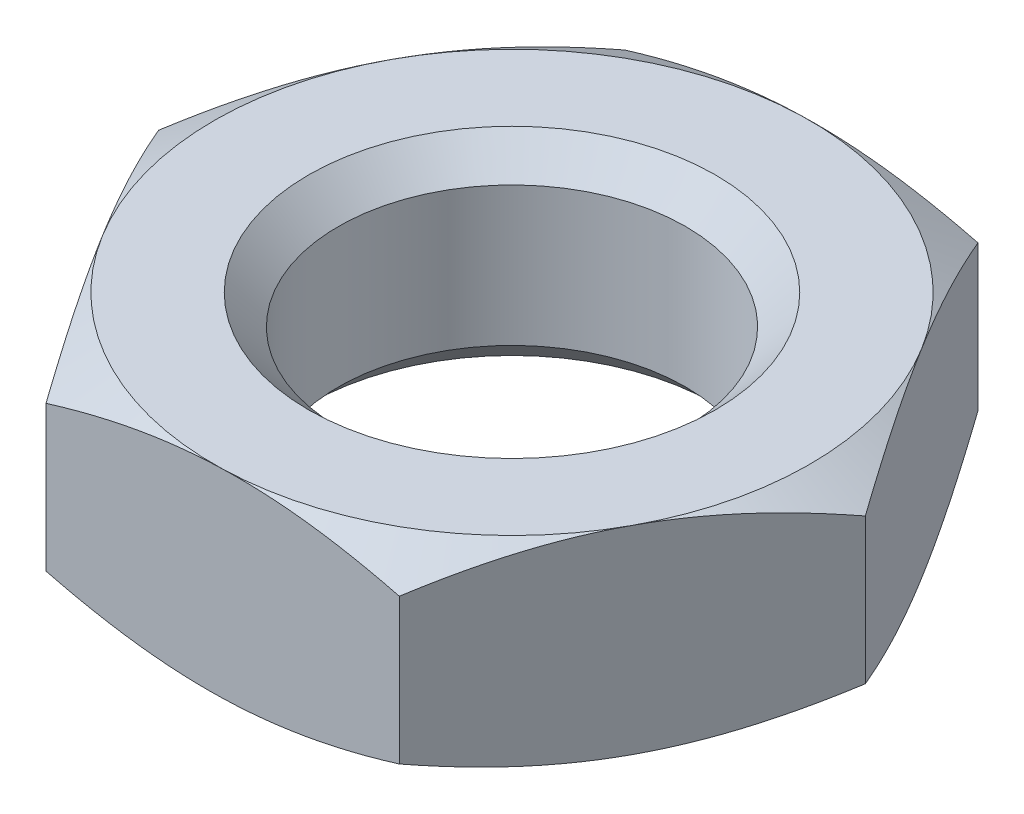
ISO-10303-21;
HEADER;
FILE_DESCRIPTION(('STEP AP214'),'2;1');
FILE_NAME('part.step','',(''),(''),'','','');
FILE_SCHEMA(('AUTOMOTIVE_DESIGN { 1 0 10303 214 1 1 1 1 }'));
ENDSEC;
DATA;
#1=APPLICATION_CONTEXT('core data for automotive mechanical design processes');
#2=APPLICATION_PROTOCOL_DEFINITION('international standard','automotive_design',2000,#1);
#3=PRODUCT_CONTEXT('',#1,'mechanical');
#4=PRODUCT('Part','Part','',(#3));
#5=PRODUCT_RELATED_PRODUCT_CATEGORY('part','',(#4));
#6=PRODUCT_DEFINITION_FORMATION('','',#4);
#7=PRODUCT_DEFINITION_CONTEXT('part definition',#1,'design');
#8=PRODUCT_DEFINITION('design','',#6,#7);
#9=PRODUCT_DEFINITION_SHAPE('','',#8);
#10=(LENGTH_UNIT() NAMED_UNIT(*) SI_UNIT(.MILLI.,.METRE.));
#11=(NAMED_UNIT(*) PLANE_ANGLE_UNIT() SI_UNIT($,.RADIAN.));
#12=(NAMED_UNIT(*) SI_UNIT($,.STERADIAN.) SOLID_ANGLE_UNIT());
#13=UNCERTAINTY_MEASURE_WITH_UNIT(LENGTH_MEASURE(1.E-05),#10,'distance_accuracy_value','');
#14=(GEOMETRIC_REPRESENTATION_CONTEXT(3) GLOBAL_UNCERTAINTY_ASSIGNED_CONTEXT((#13)) GLOBAL_UNIT_ASSIGNED_CONTEXT((#10,
#11,#12)) REPRESENTATION_CONTEXT('',''));
#15=CARTESIAN_POINT('',(0.,0.,0.));
#16=DIRECTION('',(0.,0.,1.));
#17=DIRECTION('',(1.,0.,0.));
#18=AXIS2_PLACEMENT_3D('',#15,#16,#17);
#19=CARTESIAN_POINT('',(3.462745546082,2.,-0.0969189511359436));
#20=DIRECTION('',(-0.851697340888521,0.,0.524034006075391));
#21=DIRECTION('',(0.524034006075391,0.,0.851697340888521));
#22=AXIS2_PLACEMENT_3D('',#19,#20,#21);
#23=PLANE('',#22);
#24=CARTESIAN_POINT('',(1.64731544285787,0.268016984074188,-3.0474850853164));
#25=CARTESIAN_POINT('',(1.72708927039861,0.224054733979336,-2.91783098653416));
#26=CARTESIAN_POINT('',(1.80755169990029,0.184072517976252,-2.78705772286518));
#27=CARTESIAN_POINT('',(1.96986988132658,0.114282809055525,-2.52324666881931));
#28=CARTESIAN_POINT('',(2.05172851764629,0.0845000057729693,-2.39020419051834));
#29=CARTESIAN_POINT('',(2.21443129487749,0.038138254939094,-2.12576806401426));
#30=CARTESIAN_POINT('',(2.29525040043746,0.0212507535395826,-1.99441510504519));
#31=CARTESIAN_POINT('',(2.45726893784173,0.00108975518341664,-1.7310910537774));
#32=CARTESIAN_POINT('',(2.53846778070173,-0.0022004359390661,-1.59912091873785));
#33=CARTESIAN_POINT('',(2.69019532728409,0.00464039470789215,-1.35252251774563));
#34=CARTESIAN_POINT('',(2.76074673171938,0.0130917593392975,-1.23785735697963));
#35=CARTESIAN_POINT('',(2.90138989361355,0.0398788386993799,-1.00927408640809));
#36=CARTESIAN_POINT('',(2.97148116453121,0.0582237059763719,-0.89535676736395));
#37=CARTESIAN_POINT('',(3.11241436017381,0.104084932688252,-0.666302113314549));
#38=CARTESIAN_POINT('',(3.18323844544598,0.131795717184879,-0.551193772256825));
#39=CARTESIAN_POINT('',(3.32383022575305,0.194688484263093,-0.322694010695389));
#40=CARTESIAN_POINT('',(3.39359972230189,0.229855686980896,-0.209299662243064));
#41=CARTESIAN_POINT('',(3.46286860247326,0.268016984074188,-0.0967189511359434));
#42=B_SPLINE_CURVE_WITH_KNOTS('',3,(#24,#25,#26,#27,#28,#29,#30,#31,#32,#33,#34,#35,#36,#37,#38,
#39,#40,#41),.UNSPECIFIED.,.F.,.F.,(4,2,2,2,2,2,2,2,4),(0.,0.475540096133155,0.952223323453414,
1.41710854956954,1.88142284064479,2.28572710011077,2.69040602746886,3.10406200045343,
3.51690557809824),.UNSPECIFIED.);
#43=CARTESIAN_POINT('',(1.64743849924913,0.267949192431121,-3.0472850853164));
#44=VERTEX_POINT('',#43);
#45=CARTESIAN_POINT('',(2.55509202266556,0.,-1.57210201822617));
#46=VERTEX_POINT('',#45);
#47=EDGE_CURVE('E50',#44,#46,#42,.T.);
#48=ORIENTED_EDGE('',*,*,#47,.F.);
#49=DIRECTION('',(0.,-1.,0.));
#50=VECTOR('',#49,1.);
#51=CARTESIAN_POINT('',(1.64743849924913,2.,-3.0472850853164));
#52=LINE('',#51,#50);
#53=CARTESIAN_POINT('',(1.64743849924913,1.73205080756888,-3.0472850853164));
#54=VERTEX_POINT('',#53);
#55=EDGE_CURVE('E302',#54,#44,#52,.T.);
#56=ORIENTED_EDGE('',*,*,#55,.F.);
#57=CARTESIAN_POINT('',(3.46286860247326,1.73198301592581,-0.0967189511359436));
#58=CARTESIAN_POINT('',(3.38309477493251,1.77594526602066,-0.226373049918179));
#59=CARTESIAN_POINT('',(3.30263234543083,1.81592748202375,-0.357146313587166));
#60=CARTESIAN_POINT('',(3.14031416400455,1.88571719094448,-0.62095736763303));
#61=CARTESIAN_POINT('',(3.05845552768484,1.91549999422703,-0.753999845934004));
#62=CARTESIAN_POINT('',(2.89575275045364,1.96186174506091,-1.01843597243808));
#63=CARTESIAN_POINT('',(2.81493364489367,1.97874924646042,-1.14978893140715));
#64=CARTESIAN_POINT('',(2.6529151074894,1.99891024481658,-1.41311298267495));
#65=CARTESIAN_POINT('',(2.5717162646294,2.00220043593907,-1.5450831177145));
#66=CARTESIAN_POINT('',(2.41998871804703,1.99535960529211,-1.79168151870672));
#67=CARTESIAN_POINT('',(2.34943731361175,1.9869082406607,-1.90634667947272));
#68=CARTESIAN_POINT('',(2.20879415171758,1.96012116130062,-2.13492995004426));
#69=CARTESIAN_POINT('',(2.13870288079992,1.94177629402363,-2.24884726908839));
#70=CARTESIAN_POINT('',(1.99776968515732,1.89591506731175,-2.47790192313779));
#71=CARTESIAN_POINT('',(1.92694559988515,1.86820428281512,-2.59301026419552));
#72=CARTESIAN_POINT('',(1.78635381957808,1.80531151573691,-2.82151002575695));
#73=CARTESIAN_POINT('',(1.71658432302924,1.77014431301911,-2.93490437420928));
#74=CARTESIAN_POINT('',(1.64731544285787,1.73198301592581,-3.0474850853164));
#75=B_SPLINE_CURVE_WITH_KNOTS('',3,(#57,#58,#59,#60,#61,#62,#63,#64,#65,#66,#67,#68,#69,#70,#71,
#72,#73,#74),.UNSPECIFIED.,.F.,.F.,(4,2,2,2,2,2,2,2,4),(0.,0.475540096133155,0.952223323453414,
1.41710854956954,1.88142284064479,2.28572710011077,2.69040602746886,3.10406200045343,
3.51690557809824),.UNSPECIFIED.);
#76=CARTESIAN_POINT('',(2.55509202266556,2.,-1.57210201822617));
#77=VERTEX_POINT('',#76);
#78=EDGE_CURVE('E246',#77,#54,#75,.T.);
#79=ORIENTED_EDGE('',*,*,#78,.F.);
#80=CARTESIAN_POINT('',(3.462745546082,1.73205080756888,-0.0969189511359437));
#81=VERTEX_POINT('',#80);
#82=EDGE_CURVE('E315',#81,#77,#75,.T.);
#83=ORIENTED_EDGE('',*,*,#82,.F.);
#84=DIRECTION('',(0.,-1.,0.));
#85=VECTOR('',#84,1.);
#86=CARTESIAN_POINT('',(3.462745546082,2.,-0.0969189511359436));
#87=LINE('',#86,#85);
#88=CARTESIAN_POINT('',(3.462745546082,0.267949192431121,-0.0969189511359438));
#89=VERTEX_POINT('',#88);
#90=EDGE_CURVE('E313',#81,#89,#87,.T.);
#91=ORIENTED_EDGE('',*,*,#90,.T.);
#92=EDGE_CURVE('E137',#46,#89,#42,.T.);
#93=ORIENTED_EDGE('',*,*,#92,.F.);
#94=EDGE_LOOP('',(#48,#56,#79,#83,#91,#93));
#95=FACE_BOUND('',#94,.T.);
#96=ADVANCED_FACE('F35',(#95),#23,.F.);
#97=CARTESIAN_POINT('',(1.64743849924913,2.,-3.0472850853164));
#98=DIRECTION('',(0.0279780912639563,0.,0.999608536582809));
#99=DIRECTION('',(0.999608536582809,0.,-0.0279780912639563));
#100=AXIS2_PLACEMENT_3D('',#97,#98,#99);
#101=PLANE('',#100);
#102=CARTESIAN_POINT('',(-1.81550704683287,0.268006952569929,-2.95036053637087));
#103=CARTESIAN_POINT('',(-1.66333697600728,0.224045526329508,-2.95461963178011));
#104=CARTESIAN_POINT('',(-1.50985338274207,0.184064185403547,-2.9589154914319));
#105=CARTESIAN_POINT('',(-1.20022845533424,0.114276292700907,-2.96758159837235));
#106=CARTESIAN_POINT('',(-1.04408161950867,0.0844944294173152,-2.97195199964788));
#107=CARTESIAN_POINT('',(-0.733723098671922,0.0381345368903832,-2.98063863916998));
#108=CARTESIAN_POINT('',(-0.579559166664423,0.0212479594685265,-2.98495354085546));
#109=CARTESIAN_POINT('',(-0.270505892151989,0.00108874699117062,-2.99360364777561));
#110=CARTESIAN_POINT('',(-0.115617673005451,-0.00220058147437857,-2.99793882156855));
#111=CARTESIAN_POINT('',(0.173800709600328,0.004641612670433,-3.00603936655758));
#112=CARTESIAN_POINT('',(0.308374193350208,0.013093144314734,-3.00980595024737));
#113=CARTESIAN_POINT('',(0.576644413655058,0.039879771592974,-3.01731457830765));
#114=CARTESIAN_POINT('',(0.71034022228457,0.058224017979181,-3.02105659670641));
#115=CARTESIAN_POINT('',(0.979163584898135,0.104083306428843,-3.0285807066933));
#116=CARTESIAN_POINT('',(1.11425711420825,0.13179274861191,-3.03236184596321));
#117=CARTESIAN_POINT('',(1.3824292594286,0.194682321011008,-3.03986772899526));
#118=CARTESIAN_POINT('',(1.51551131114424,0.229847673897554,-3.04359256892232));
#119=CARTESIAN_POINT('',(1.64763849924913,0.268006952569928,-3.04729068312599));
#120=B_SPLINE_CURVE_WITH_KNOTS('',3,(#102,#103,#104,#105,#106,#107,#108,#109,#110,#111,#112,
#113,#114,#115,#116,#117,#118,#119),.UNSPECIFIED.,.F.,.F.,(4,2,2,2,2,2,2,2,4),(0.,
0.475537716870858,0.952218499772851,1.41710157396388,1.88141373908015,2.28570262186387,
2.69036611455787,3.10400583606905,3.51683327751342),.UNSPECIFIED.);
#121=CARTESIAN_POINT('',(-1.81530704683287,0.267949192431122,-2.95036613418046));
#122=VERTEX_POINT('',#121);
#123=CARTESIAN_POINT('',(-0.083934273791869,0.,-2.99882560974843));
#124=VERTEX_POINT('',#123);
#125=EDGE_CURVE('E58',#122,#124,#120,.T.);
#126=ORIENTED_EDGE('',*,*,#125,.F.);
#127=DIRECTION('',(0.,-1.,0.));
#128=VECTOR('',#127,1.);
#129=CARTESIAN_POINT('',(-1.81530704683287,2.,-2.95036613418046));
#130=LINE('',#129,#128);
#131=CARTESIAN_POINT('',(-1.81530704683287,1.73205080756888,-2.95036613418046));
#132=VERTEX_POINT('',#131);
#133=EDGE_CURVE('E305',#132,#122,#130,.T.);
#134=ORIENTED_EDGE('',*,*,#133,.F.);
#135=CARTESIAN_POINT('',(1.64763849924913,1.73199304743007,-3.04729068312599));
#136=CARTESIAN_POINT('',(1.49546842842354,1.77595447367049,-3.04303158771675));
#137=CARTESIAN_POINT('',(1.34198483515833,1.81593581459645,-3.03873572806495));
#138=CARTESIAN_POINT('',(1.03235990775051,1.88572370729909,-3.0300696211245));
#139=CARTESIAN_POINT('',(0.876213071924926,1.91550557058269,-3.02569921984898));
#140=CARTESIAN_POINT('',(0.565854551088183,1.96186546310962,-3.01701258032687));
#141=CARTESIAN_POINT('',(0.411690619080683,1.97875204053147,-3.0126976786414));
#142=CARTESIAN_POINT('',(0.102637344568249,1.99891125300883,-3.00404757172125));
#143=CARTESIAN_POINT('',(-0.0522508745782886,2.00220058147438,-2.99971239792831));
#144=CARTESIAN_POINT('',(-0.341669257184068,1.99535838732957,-2.99161185293928));
#145=CARTESIAN_POINT('',(-0.476242740933948,1.98690685568527,-2.98784526924949));
#146=CARTESIAN_POINT('',(-0.744512961238798,1.96012022840703,-2.9803366411892));
#147=CARTESIAN_POINT('',(-0.878208769868309,1.94177598202082,-2.97659462279045));
#148=CARTESIAN_POINT('',(-1.14703213248187,1.89591669357116,-2.96907051280355));
#149=CARTESIAN_POINT('',(-1.28212566179199,1.86820725138809,-2.96528937353365));
#150=CARTESIAN_POINT('',(-1.55029780701234,1.80531767898899,-2.9577834905016));
#151=CARTESIAN_POINT('',(-1.68337985872797,1.77015232610245,-2.95405865057454));
#152=CARTESIAN_POINT('',(-1.81550704683287,1.73199304743007,-2.95036053637087));
#153=B_SPLINE_CURVE_WITH_KNOTS('',3,(#135,#136,#137,#138,#139,#140,#141,#142,#143,#144,#145,
#146,#147,#148,#149,#150,#151,#152),.UNSPECIFIED.,.F.,.F.,(4,2,2,2,2,2,2,2,4),(0.,
0.475537716870859,0.952218499772851,1.41710157396388,1.88141373908015,2.28570262186387,
2.69036611455787,3.10400583606905,3.51683327751342),.UNSPECIFIED.);
#154=CARTESIAN_POINT('',(-0.083934273791869,2.,-2.99882560974843));
#155=VERTEX_POINT('',#154);
#156=EDGE_CURVE('E240',#155,#132,#153,.T.);
#157=ORIENTED_EDGE('',*,*,#156,.F.);
#158=EDGE_CURVE('E245',#54,#155,#153,.T.);
#159=ORIENTED_EDGE('',*,*,#158,.F.);
#160=ORIENTED_EDGE('',*,*,#55,.T.);
#161=EDGE_CURVE('E164',#124,#44,#120,.T.);
#162=ORIENTED_EDGE('',*,*,#161,.F.);
#163=EDGE_LOOP('',(#126,#134,#157,#159,#160,#162));
#164=FACE_BOUND('',#163,.T.);
#165=ADVANCED_FACE('F251',(#164),#101,.F.);
#166=CARTESIAN_POINT('',(-1.81530704683287,2.,-2.95036613418046));
#167=DIRECTION('',(0.879675432152478,0.,0.475574530507419));
#168=DIRECTION('',(0.475574530507419,0.,-0.879675432152478));
#169=AXIS2_PLACEMENT_3D('',#166,#167,#168);
#170=PLANE('',#169);
#171=CARTESIAN_POINT('',(-3.462853671082,0.26801482785377,0.097118951135944));
#172=CARTESIAN_POINT('',(-3.39045690154788,0.22405275484099,-0.0367941485803423));
#173=CARTESIAN_POINT('',(-3.31743520815615,0.184070726929937,-0.171863176819393));
#174=CARTESIAN_POINT('',(-3.17012735085773,0.114281408393386,-0.444340138296242));
#175=CARTESIAN_POINT('',(-3.09583856932569,0.0844988071575115,-0.581752913384413));
#176=CARTESIAN_POINT('',(-2.94818168468663,0.0381374557548399,-0.854875474566507));
#177=CARTESIAN_POINT('',(-2.87483630155009,0.0212501529585004,-0.990543235281486));
#178=CARTESIAN_POINT('',(-2.7278003865963,0.00108953846604236,-1.26251718201683));
#179=CARTESIAN_POINT('',(-2.65411038928288,-0.00220046723345343,-1.39882237935958));
#180=CARTESIAN_POINT('',(-2.51641428310708,0.00464065649351373,-1.65352037922233));
#181=CARTESIAN_POINT('',(-2.45238757090593,0.0130920570264827,-1.77195129196436));
#182=CARTESIAN_POINT('',(-2.32475128389122,0.0398790392182052,-2.00804153384129));
#183=CARTESIAN_POINT('',(-2.26114215060968,0.0582237730392041,-2.12570004626957));
#184=CARTESIAN_POINT('',(-2.1332426611027,0.104084583132967,-2.36227713668712));
#185=CARTESIAN_POINT('',(-2.06896849418094,0.131795079106134,-2.48116576914355));
#186=CARTESIAN_POINT('',(-1.9413788437772,0.194687159504046,-2.71716974676896));
#187=CARTESIAN_POINT('',(-1.87806172543869,0.229853964609763,-2.83428811595002));
#188=CARTESIAN_POINT('',(-1.81519892183287,0.26801482785377,-2.95056613418046));
#189=B_SPLINE_CURVE_WITH_KNOTS('',3,(#171,#172,#173,#174,#175,#176,#177,#178,#179,#180,#181,
#182,#183,#184,#185,#186,#187,#188),.UNSPECIFIED.,.F.,.F.,(4,2,2,2,2,2,2,2,4),(0.,
0.475539584723106,0.952222286628379,1.41710705019919,1.88142088431043,2.28572183865985,
2.69039744843812,3.10404992827143,3.51689003754303),.UNSPECIFIED.);
#190=CARTESIAN_POINT('',(-3.462745546082,0.267949192431121,0.0969189511359441));
#191=VERTEX_POINT('',#190);
#192=CARTESIAN_POINT('',(-2.63902629645743,0.,-1.42672359152226));
#193=VERTEX_POINT('',#192);
#194=EDGE_CURVE('E347',#191,#193,#189,.T.);
#195=ORIENTED_EDGE('',*,*,#194,.F.);
#196=DIRECTION('',(0.,-1.,0.));
#197=VECTOR('',#196,1.);
#198=CARTESIAN_POINT('',(-3.462745546082,2.,0.0969189511359441));
#199=LINE('',#198,#197);
#200=CARTESIAN_POINT('',(-3.462745546082,1.73205080756888,0.0969189511359442));
#201=VERTEX_POINT('',#200);
#202=EDGE_CURVE('E308',#201,#191,#199,.T.);
#203=ORIENTED_EDGE('',*,*,#202,.F.);
#204=CARTESIAN_POINT('',(-1.81519892183287,1.73198517214623,-2.95056613418046));
#205=CARTESIAN_POINT('',(-1.88759569136698,1.77594724515901,-2.81665303446417));
#206=CARTESIAN_POINT('',(-1.96061738475872,1.81592927307006,-2.68158400622512));
#207=CARTESIAN_POINT('',(-2.10792524205714,1.88571859160661,-2.40910704474827));
#208=CARTESIAN_POINT('',(-2.18221402358918,1.91550119284249,-2.2716942696601));
#209=CARTESIAN_POINT('',(-2.32987090822824,1.96186254424516,-1.99857170847801));
#210=CARTESIAN_POINT('',(-2.40321629136477,1.9787498470415,-1.86290394776303));
#211=CARTESIAN_POINT('',(-2.55025220631857,1.99891046153396,-1.59093000102768));
#212=CARTESIAN_POINT('',(-2.62394220363199,2.00220046723345,-1.45462480368493));
#213=CARTESIAN_POINT('',(-2.76163830980778,1.99535934350649,-1.19992680382218));
#214=CARTESIAN_POINT('',(-2.82566502200894,1.98690794297352,-1.08149589108016));
#215=CARTESIAN_POINT('',(-2.95330130902365,1.9601209607818,-0.845405649203224));
#216=CARTESIAN_POINT('',(-3.01691044230519,1.9417762269608,-0.727747136774939));
#217=CARTESIAN_POINT('',(-3.14480993181217,1.89591541686703,-0.491170046357393));
#218=CARTESIAN_POINT('',(-3.20908409873393,1.86820492089387,-0.37228141390096));
#219=CARTESIAN_POINT('',(-3.33667374913766,1.80531284049595,-0.136277436275548));
#220=CARTESIAN_POINT('',(-3.39999086747617,1.77014603539024,-0.0191590670944889));
#221=CARTESIAN_POINT('',(-3.462853671082,1.73198517214623,0.097118951135944));
#222=B_SPLINE_CURVE_WITH_KNOTS('',3,(#204,#205,#206,#207,#208,#209,#210,#211,#212,#213,#214,
#215,#216,#217,#218,#219,#220,#221),.UNSPECIFIED.,.F.,.F.,(4,2,2,2,2,2,2,2,4),(0.,
0.475539584723106,0.952222286628379,1.41710705019919,1.88142088431043,2.28572183865985,
2.69039744843812,3.10404992827143,3.51689003754303),.UNSPECIFIED.);
#223=CARTESIAN_POINT('',(-2.63902629645743,2.,-1.42672359152226));
#224=VERTEX_POINT('',#223);
#225=EDGE_CURVE('E234',#224,#201,#222,.T.);
#226=ORIENTED_EDGE('',*,*,#225,.F.);
#227=EDGE_CURVE('E239',#132,#224,#222,.T.);
#228=ORIENTED_EDGE('',*,*,#227,.F.);
#229=ORIENTED_EDGE('',*,*,#133,.T.);
#230=EDGE_CURVE('E197',#193,#122,#189,.T.);
#231=ORIENTED_EDGE('',*,*,#230,.F.);
#232=EDGE_LOOP('',(#195,#203,#226,#228,#229,#231));
#233=FACE_BOUND('',#232,.T.);
#234=ADVANCED_FACE('F217',(#233),#170,.F.);
#235=CARTESIAN_POINT('',(-3.462745546082,2.,0.0969189511359441));
#236=DIRECTION('',(0.851697340888521,0.,-0.524034006075391));
#237=DIRECTION('',(-0.524034006075391,0.,-0.851697340888521));
#238=AXIS2_PLACEMENT_3D('',#235,#236,#237);
#239=PLANE('',#238);
#240=CARTESIAN_POINT('',(-1.64731544285787,0.268016984074188,3.0474850853164));
#241=CARTESIAN_POINT('',(-1.72708927039861,0.224054733979336,2.91783098653416));
#242=CARTESIAN_POINT('',(-1.80755169990029,0.184072517976252,2.78705772286518));
#243=CARTESIAN_POINT('',(-1.96986988132658,0.114282809055525,2.52324666881931));
#244=CARTESIAN_POINT('',(-2.05172851764629,0.0845000057729693,2.39020419051834));
#245=CARTESIAN_POINT('',(-2.21443129487749,0.0381382549390942,2.12576806401426));
#246=CARTESIAN_POINT('',(-2.29525040043746,0.0212507535395832,1.99441510504519));
#247=CARTESIAN_POINT('',(-2.45726893784173,0.00108975518341713,1.7310910537774));
#248=CARTESIAN_POINT('',(-2.53846778070173,-0.00220043593906603,1.59912091873785));
#249=CARTESIAN_POINT('',(-2.69019532728409,0.0046403947078922,1.35252251774563));
#250=CARTESIAN_POINT('',(-2.76074673171938,0.0130917593392979,1.23785735697963));
#251=CARTESIAN_POINT('',(-2.90138989361355,0.0398788386993802,1.00927408640809));
#252=CARTESIAN_POINT('',(-2.97148116453121,0.0582237059763719,0.89535676736395));
#253=CARTESIAN_POINT('',(-3.11241436017381,0.104084932688252,0.66630211331455));
#254=CARTESIAN_POINT('',(-3.18323844544598,0.131795717184879,0.551193772256826));
#255=CARTESIAN_POINT('',(-3.32383022575305,0.194688484263094,0.322694010695389));
#256=CARTESIAN_POINT('',(-3.39359972230189,0.229855686980896,0.209299662243064));
#257=CARTESIAN_POINT('',(-3.46286860247326,0.268016984074188,0.0967189511359438));
#258=B_SPLINE_CURVE_WITH_KNOTS('',3,(#240,#241,#242,#243,#244,#245,#246,#247,#248,#249,#250,
#251,#252,#253,#254,#255,#256,#257),.UNSPECIFIED.,.F.,.F.,(4,2,2,2,2,2,2,2,4),(0.,
0.475540096133155,0.952223323453413,1.41710854956954,1.88142284064479,2.28572710011077,
2.69040602746886,3.10406200045343,3.51690557809824),.UNSPECIFIED.);
#259=CARTESIAN_POINT('',(-1.64743849924913,0.267949192431121,3.0472850853164));
#260=VERTEX_POINT('',#259);
#261=CARTESIAN_POINT('',(-2.55509202266556,0.,1.57210201822617));
#262=VERTEX_POINT('',#261);
#263=EDGE_CURVE('E147',#260,#262,#258,.T.);
#264=ORIENTED_EDGE('',*,*,#263,.F.);
#265=DIRECTION('',(0.,-1.,0.));
#266=VECTOR('',#265,1.);
#267=CARTESIAN_POINT('',(-1.64743849924913,2.,3.0472850853164));
#268=LINE('',#267,#266);
#269=CARTESIAN_POINT('',(-1.64743849924913,1.73205080756888,3.0472850853164));
#270=VERTEX_POINT('',#269);
#271=EDGE_CURVE('E163',#270,#260,#268,.T.);
#272=ORIENTED_EDGE('',*,*,#271,.F.);
#273=CARTESIAN_POINT('',(-3.46286860247326,1.73198301592581,0.0967189511359441));
#274=CARTESIAN_POINT('',(-3.38309477493251,1.77594526602066,0.22637304991818));
#275=CARTESIAN_POINT('',(-3.30263234543083,1.81592748202375,0.357146313587167));
#276=CARTESIAN_POINT('',(-3.14031416400455,1.88571719094448,0.620957367633031));
#277=CARTESIAN_POINT('',(-3.05845552768484,1.91549999422703,0.753999845934005));
#278=CARTESIAN_POINT('',(-2.89575275045364,1.96186174506091,1.01843597243808));
#279=CARTESIAN_POINT('',(-2.81493364489367,1.97874924646042,1.14978893140715));
#280=CARTESIAN_POINT('',(-2.6529151074894,1.99891024481658,1.41311298267495));
#281=CARTESIAN_POINT('',(-2.5717162646294,2.00220043593907,1.5450831177145));
#282=CARTESIAN_POINT('',(-2.41998871804703,1.99535960529211,1.79168151870672));
#283=CARTESIAN_POINT('',(-2.34943731361175,1.9869082406607,1.90634667947272));
#284=CARTESIAN_POINT('',(-2.20879415171758,1.96012116130062,2.13492995004426));
#285=CARTESIAN_POINT('',(-2.13870288079992,1.94177629402363,2.24884726908839));
#286=CARTESIAN_POINT('',(-1.99776968515732,1.89591506731175,2.47790192313779));
#287=CARTESIAN_POINT('',(-1.92694559988515,1.86820428281512,2.59301026419552));
#288=CARTESIAN_POINT('',(-1.78635381957808,1.80531151573691,2.82151002575695));
#289=CARTESIAN_POINT('',(-1.71658432302924,1.7701443130191,2.93490437420928));
#290=CARTESIAN_POINT('',(-1.64731544285787,1.73198301592581,3.0474850853164));
#291=B_SPLINE_CURVE_WITH_KNOTS('',3,(#273,#274,#275,#276,#277,#278,#279,#280,#281,#282,#283,
#284,#285,#286,#287,#288,#289,#290),.UNSPECIFIED.,.F.,.F.,(4,2,2,2,2,2,2,2,4),(0.,
0.475540096133155,0.952223323453414,1.41710854956954,1.88142284064479,2.28572710011077,
2.69040602746886,3.10406200045342,3.51690557809823),.UNSPECIFIED.);
#292=CARTESIAN_POINT('',(-2.55509202266556,2.,1.57210201822617));
#293=VERTEX_POINT('',#292);
#294=EDGE_CURVE('E222',#293,#270,#291,.T.);
#295=ORIENTED_EDGE('',*,*,#294,.F.);
#296=EDGE_CURVE('E228',#201,#293,#291,.T.);
#297=ORIENTED_EDGE('',*,*,#296,.F.);
#298=ORIENTED_EDGE('',*,*,#202,.T.);
#299=EDGE_CURVE('E166',#262,#191,#258,.T.);
#300=ORIENTED_EDGE('',*,*,#299,.F.);
#301=EDGE_LOOP('',(#264,#272,#295,#297,#298,#300));
#302=FACE_BOUND('',#301,.T.);
#303=ADVANCED_FACE('F214',(#302),#239,.F.);
#304=CARTESIAN_POINT('',(-1.64743849924913,2.,3.0472850853164));
#305=DIRECTION('',(-0.0279780912639565,0.,-0.999608536582809));
#306=DIRECTION('',(-0.999608536582809,0.,0.0279780912639565));
#307=AXIS2_PLACEMENT_3D('',#304,#305,#306);
#308=PLANE('',#307);
#309=CARTESIAN_POINT('',(1.81550704683287,0.268006952569928,2.95036053637087));
#310=CARTESIAN_POINT('',(1.66333697600728,0.224045526329508,2.95461963178011));
#311=CARTESIAN_POINT('',(1.50985338274207,0.184064185403547,2.9589154914319));
#312=CARTESIAN_POINT('',(1.20022845533424,0.114276292700907,2.96758159837235));
#313=CARTESIAN_POINT('',(1.04408161950867,0.0844944294173153,2.97195199964788));
#314=CARTESIAN_POINT('',(0.733723098671922,0.0381345368903832,2.98063863916998));
#315=CARTESIAN_POINT('',(0.579559166664422,0.0212479594685263,2.98495354085546));
#316=CARTESIAN_POINT('',(0.270505892151988,0.0010887469911705,2.99360364777561));
#317=CARTESIAN_POINT('',(0.11561767300545,-0.00220058147437849,2.99793882156855));
#318=CARTESIAN_POINT('',(-0.173800709600328,0.00464161267043321,3.00603936655758));
#319=CARTESIAN_POINT('',(-0.308374193350208,0.0130931443147342,3.00980595024737));
#320=CARTESIAN_POINT('',(-0.576644413655059,0.0398797715929741,3.01731457830766));
#321=CARTESIAN_POINT('',(-0.71034022228457,0.0582240179791812,3.02105659670641));
#322=CARTESIAN_POINT('',(-0.979163584898135,0.104083306428843,3.0285807066933));
#323=CARTESIAN_POINT('',(-1.11425711420825,0.131792748611911,3.03236184596321));
#324=CARTESIAN_POINT('',(-1.3824292594286,0.194682321011008,3.03986772899526));
#325=CARTESIAN_POINT('',(-1.51551131114424,0.229847673897554,3.04359256892232));
#326=CARTESIAN_POINT('',(-1.64763849924913,0.268006952569928,3.04729068312599));
#327=B_SPLINE_CURVE_WITH_KNOTS('',3,(#309,#310,#311,#312,#313,#314,#315,#316,#317,#318,#319,
#320,#321,#322,#323,#324,#325,#326),.UNSPECIFIED.,.F.,.F.,(4,2,2,2,2,2,2,2,4),(0.,
0.475537716870858,0.952218499772851,1.41710157396388,1.88141373908015,2.28570262186387,
2.69036611455787,3.10400583606905,3.51683327751342),.UNSPECIFIED.);
#328=CARTESIAN_POINT('',(1.81530704683287,0.267949192431121,2.95036613418046));
#329=VERTEX_POINT('',#328);
#330=CARTESIAN_POINT('',(0.0839342737918694,0.,2.99882560974843));
#331=VERTEX_POINT('',#330);
#332=EDGE_CURVE('E125',#329,#331,#327,.T.);
#333=ORIENTED_EDGE('',*,*,#332,.F.);
#334=DIRECTION('',(0.,-1.,0.));
#335=VECTOR('',#334,1.);
#336=CARTESIAN_POINT('',(1.81530704683287,2.,2.95036613418046));
#337=LINE('',#336,#335);
#338=CARTESIAN_POINT('',(1.81530704683287,1.73205080756888,2.95036613418046));
#339=VERTEX_POINT('',#338);
#340=EDGE_CURVE('E312',#339,#329,#337,.T.);
#341=ORIENTED_EDGE('',*,*,#340,.F.);
#342=CARTESIAN_POINT('',(-1.64763849924913,1.73199304743007,3.04729068312599));
#343=CARTESIAN_POINT('',(-1.49546842842354,1.77595447367049,3.04303158771675));
#344=CARTESIAN_POINT('',(-1.34198483515833,1.81593581459645,3.03873572806495));
#345=CARTESIAN_POINT('',(-1.03235990775051,1.88572370729909,3.0300696211245));
#346=CARTESIAN_POINT('',(-0.876213071924926,1.91550557058269,3.02569921984898));
#347=CARTESIAN_POINT('',(-0.565854551088183,1.96186546310962,3.01701258032687));
#348=CARTESIAN_POINT('',(-0.411690619080683,1.97875204053147,3.0126976786414));
#349=CARTESIAN_POINT('',(-0.102637344568249,1.99891125300883,3.00404757172125));
#350=CARTESIAN_POINT('',(0.052250874578289,2.00220058147438,2.99971239792831));
#351=CARTESIAN_POINT('',(0.341669257184068,1.99535838732957,2.99161185293928));
#352=CARTESIAN_POINT('',(0.476242740933948,1.98690685568527,2.98784526924949));
#353=CARTESIAN_POINT('',(0.744512961238798,1.96012022840703,2.9803366411892));
#354=CARTESIAN_POINT('',(0.87820876986831,1.94177598202082,2.97659462279045));
#355=CARTESIAN_POINT('',(1.14703213248188,1.89591669357116,2.96907051280355));
#356=CARTESIAN_POINT('',(1.28212566179199,1.86820725138809,2.96528937353365));
#357=CARTESIAN_POINT('',(1.55029780701234,1.80531767898899,2.9577834905016));
#358=CARTESIAN_POINT('',(1.68337985872797,1.77015232610245,2.95405865057454));
#359=CARTESIAN_POINT('',(1.81550704683287,1.73199304743007,2.95036053637087));
#360=B_SPLINE_CURVE_WITH_KNOTS('',3,(#342,#343,#344,#345,#346,#347,#348,#349,#350,#351,#352,
#353,#354,#355,#356,#357,#358,#359),.UNSPECIFIED.,.F.,.F.,(4,2,2,2,2,2,2,2,4),(0.,
0.475537716870859,0.952218499772851,1.41710157396388,1.88141373908015,2.28570262186387,
2.69036611455787,3.10400583606905,3.51683327751342),.UNSPECIFIED.);
#361=CARTESIAN_POINT('',(0.0839342737918693,2.,2.99882560974843));
#362=VERTEX_POINT('',#361);
#363=EDGE_CURVE('E230',#362,#339,#360,.T.);
#364=ORIENTED_EDGE('',*,*,#363,.F.);
#365=EDGE_CURVE('E229',#270,#362,#360,.T.);
#366=ORIENTED_EDGE('',*,*,#365,.F.);
#367=ORIENTED_EDGE('',*,*,#271,.T.);
#368=EDGE_CURVE('E140',#331,#260,#327,.T.);
#369=ORIENTED_EDGE('',*,*,#368,.F.);
#370=EDGE_LOOP('',(#333,#341,#364,#366,#367,#369));
#371=FACE_BOUND('',#370,.T.);
#372=ADVANCED_FACE('F160',(#371),#308,.F.);
#373=CARTESIAN_POINT('',(1.81530704683287,2.,2.95036613418046));
#374=DIRECTION('',(-0.879675432152478,0.,-0.475574530507419));
#375=DIRECTION('',(-0.475574530507419,0.,0.879675432152478));
#376=AXIS2_PLACEMENT_3D('',#373,#374,#375);
#377=PLANE('',#376);
#378=CARTESIAN_POINT('',(3.462853671082,0.26801482785377,-0.0971189511359436));
#379=CARTESIAN_POINT('',(3.39045690154788,0.22405275484099,0.0367941485803424));
#380=CARTESIAN_POINT('',(3.31743520815615,0.184070726929937,0.171863176819393));
#381=CARTESIAN_POINT('',(3.17012735085773,0.114281408393386,0.444340138296242));
#382=CARTESIAN_POINT('',(3.09583856932569,0.0844988071575114,0.581752913384413));
#383=CARTESIAN_POINT('',(2.94818168468663,0.0381374557548398,0.854875474566507));
#384=CARTESIAN_POINT('',(2.87483630155009,0.0212501529585003,0.990543235281486));
#385=CARTESIAN_POINT('',(2.7278003865963,0.00108953846604241,1.26251718201683));
#386=CARTESIAN_POINT('',(2.65411038928288,-0.00220046723345331,1.39882237935958));
#387=CARTESIAN_POINT('',(2.51641428310708,0.00464065649351374,1.65352037922233));
#388=CARTESIAN_POINT('',(2.45238757090593,0.0130920570264826,1.77195129196436));
#389=CARTESIAN_POINT('',(2.32475128389122,0.0398790392182049,2.00804153384129));
#390=CARTESIAN_POINT('',(2.26114215060968,0.0582237730392039,2.12570004626957));
#391=CARTESIAN_POINT('',(2.13324266110269,0.104084583132967,2.36227713668712));
#392=CARTESIAN_POINT('',(2.06896849418094,0.131795079106134,2.48116576914355));
#393=CARTESIAN_POINT('',(1.9413788437772,0.194687159504047,2.71716974676896));
#394=CARTESIAN_POINT('',(1.87806172543869,0.229853964609764,2.83428811595002));
#395=CARTESIAN_POINT('',(1.81519892183287,0.26801482785377,2.95056613418046));
#396=B_SPLINE_CURVE_WITH_KNOTS('',3,(#378,#379,#380,#381,#382,#383,#384,#385,#386,#387,#388,
#389,#390,#391,#392,#393,#394,#395),.UNSPECIFIED.,.F.,.F.,(4,2,2,2,2,2,2,2,4),(0.,
0.475539584723106,0.952222286628379,1.41710705019919,1.88142088431043,2.28572183865985,
2.69039744843812,3.10404992827143,3.51689003754303),.UNSPECIFIED.);
#397=CARTESIAN_POINT('',(2.63902629645743,0.,1.42672359152226));
#398=VERTEX_POINT('',#397);
#399=EDGE_CURVE('E138',#89,#398,#396,.T.);
#400=ORIENTED_EDGE('',*,*,#399,.F.);
#401=ORIENTED_EDGE('',*,*,#90,.F.);
#402=CARTESIAN_POINT('',(1.81519892183287,1.73198517214623,2.95056613418046));
#403=CARTESIAN_POINT('',(1.88759569136698,1.77594724515901,2.81665303446417));
#404=CARTESIAN_POINT('',(1.96061738475872,1.81592927307006,2.68158400622512));
#405=CARTESIAN_POINT('',(2.10792524205714,1.88571859160661,2.40910704474827));
#406=CARTESIAN_POINT('',(2.18221402358918,1.91550119284249,2.2716942696601));
#407=CARTESIAN_POINT('',(2.32987090822824,1.96186254424516,1.99857170847801));
#408=CARTESIAN_POINT('',(2.40321629136477,1.9787498470415,1.86290394776303));
#409=CARTESIAN_POINT('',(2.55025220631857,1.99891046153396,1.59093000102768));
#410=CARTESIAN_POINT('',(2.62394220363199,2.00220046723345,1.45462480368493));
#411=CARTESIAN_POINT('',(2.76163830980778,1.99535934350649,1.19992680382218));
#412=CARTESIAN_POINT('',(2.82566502200894,1.98690794297352,1.08149589108016));
#413=CARTESIAN_POINT('',(2.95330130902365,1.9601209607818,0.845405649203225));
#414=CARTESIAN_POINT('',(3.01691044230519,1.9417762269608,0.727747136774939));
#415=CARTESIAN_POINT('',(3.14480993181217,1.89591541686703,0.491170046357393));
#416=CARTESIAN_POINT('',(3.20908409873393,1.86820492089387,0.37228141390096));
#417=CARTESIAN_POINT('',(3.33667374913766,1.80531284049595,0.136277436275548));
#418=CARTESIAN_POINT('',(3.39999086747617,1.77014603539024,0.0191590670944892));
#419=CARTESIAN_POINT('',(3.462853671082,1.73198517214623,-0.0971189511359434));
#420=B_SPLINE_CURVE_WITH_KNOTS('',3,(#402,#403,#404,#405,#406,#407,#408,#409,#410,#411,#412,
#413,#414,#415,#416,#417,#418,#419),.UNSPECIFIED.,.F.,.F.,(4,2,2,2,2,2,2,2,4),(0.,
0.475539584723106,0.952222286628379,1.41710705019919,1.88142088431043,2.28572183865985,
2.69039744843812,3.10404992827143,3.51689003754303),.UNSPECIFIED.);
#421=CARTESIAN_POINT('',(2.63902629645743,2.,1.42672359152226));
#422=VERTEX_POINT('',#421);
#423=EDGE_CURVE('E297',#422,#81,#420,.T.);
#424=ORIENTED_EDGE('',*,*,#423,.F.);
#425=EDGE_CURVE('E152',#339,#422,#420,.T.);
#426=ORIENTED_EDGE('',*,*,#425,.F.);
#427=ORIENTED_EDGE('',*,*,#340,.T.);
#428=EDGE_CURVE('E132',#398,#329,#396,.T.);
#429=ORIENTED_EDGE('',*,*,#428,.F.);
#430=EDGE_LOOP('',(#400,#401,#424,#426,#427,#429));
#431=FACE_BOUND('',#430,.T.);
#432=ADVANCED_FACE('F285',(#431),#377,.F.);
#433=CARTESIAN_POINT('',(0.,0.,0.));
#434=DIRECTION('',(0.,1.,0.));
#435=DIRECTION('',(0.,0.,1.));
#436=AXIS2_PLACEMENT_3D('',#433,#434,#435);
#437=PLANE('',#436);
#438=CARTESIAN_POINT('',(0.,0.,0.));
#439=DIRECTION('',(0.,1.,0.));
#440=DIRECTION('',(0.,0.,1.));
#441=AXIS2_PLACEMENT_3D('',#438,#439,#440);
#442=CIRCLE('',#441,2.05);
#443=CARTESIAN_POINT('',(0.,0.,2.05));
#444=VERTEX_POINT('',#443);
#445=EDGE_CURVE('E43',#444,#444,#442,.T.);
#446=ORIENTED_EDGE('',*,*,#445,.T.);
#447=EDGE_LOOP('',(#446));
#448=FACE_BOUND('',#447,.T.);
#449=CARTESIAN_POINT('',(0.,0.,0.));
#450=DIRECTION('',(0.,1.,0.));
#451=DIRECTION('',(0.,0.,1.));
#452=AXIS2_PLACEMENT_3D('',#449,#450,#451);
#453=CIRCLE('',#452,3.);
#454=EDGE_CURVE('E129',#331,#398,#453,.T.);
#455=ORIENTED_EDGE('',*,*,#454,.F.);
#456=EDGE_CURVE('E144',#262,#331,#453,.T.);
#457=ORIENTED_EDGE('',*,*,#456,.F.);
#458=EDGE_CURVE('E151',#193,#262,#453,.T.);
#459=ORIENTED_EDGE('',*,*,#458,.F.);
#460=EDGE_CURVE('E520',#124,#193,#453,.T.);
#461=ORIENTED_EDGE('',*,*,#460,.F.);
#462=EDGE_CURVE('E158',#46,#124,#453,.T.);
#463=ORIENTED_EDGE('',*,*,#462,.F.);
#464=CARTESIAN_POINT('',(0.,0.,0.));
#465=DIRECTION('',(0.,-1.,0.));
#466=DIRECTION('',(0.,0.,-1.));
#467=AXIS2_PLACEMENT_3D('',#464,#465,#466);
#468=CIRCLE('',#467,3.);
#469=EDGE_CURVE('E156',#46,#398,#468,.T.);
#470=ORIENTED_EDGE('',*,*,#469,.T.);
#471=EDGE_LOOP('',(#455,#457,#459,#461,#463,#470));
#472=FACE_BOUND('',#471,.T.);
#473=ADVANCED_FACE('F154',(#448,#472),#437,.F.);
#474=CARTESIAN_POINT('',(0.,2.,0.));
#475=DIRECTION('',(0.,1.,0.));
#476=DIRECTION('',(0.,0.,1.));
#477=AXIS2_PLACEMENT_3D('',#474,#475,#476);
#478=PLANE('',#477);
#479=CARTESIAN_POINT('',(0.,2.,0.));
#480=DIRECTION('',(0.,1.,0.));
#481=DIRECTION('',(0.,0.,1.));
#482=AXIS2_PLACEMENT_3D('',#479,#480,#481);
#483=CIRCLE('',#482,2.05);
#484=CARTESIAN_POINT('',(0.,2.,2.05));
#485=VERTEX_POINT('',#484);
#486=EDGE_CURVE('E272',#485,#485,#483,.F.);
#487=ORIENTED_EDGE('',*,*,#486,.T.);
#488=EDGE_LOOP('',(#487));
#489=FACE_BOUND('',#488,.T.);
#490=CARTESIAN_POINT('',(0.,2.,0.));
#491=DIRECTION('',(0.,1.,0.));
#492=DIRECTION('',(0.,0.,1.));
#493=AXIS2_PLACEMENT_3D('',#490,#491,#492);
#494=CIRCLE('',#493,3.);
#495=EDGE_CURVE('E345',#293,#362,#494,.T.);
#496=ORIENTED_EDGE('',*,*,#495,.T.);
#497=EDGE_CURVE('E343',#362,#422,#494,.T.);
#498=ORIENTED_EDGE('',*,*,#497,.T.);
#499=EDGE_CURVE('E342',#422,#77,#494,.T.);
#500=ORIENTED_EDGE('',*,*,#499,.T.);
#501=EDGE_CURVE('E329',#77,#155,#494,.T.);
#502=ORIENTED_EDGE('',*,*,#501,.T.);
#503=EDGE_CURVE('E340',#155,#224,#494,.T.);
#504=ORIENTED_EDGE('',*,*,#503,.T.);
#505=EDGE_CURVE('E344',#224,#293,#494,.T.);
#506=ORIENTED_EDGE('',*,*,#505,.T.);
#507=EDGE_LOOP('',(#496,#498,#500,#502,#504,#506));
#508=FACE_BOUND('',#507,.T.);
#509=ADVANCED_FACE('F284',(#489,#508),#478,.T.);
#510=CARTESIAN_POINT('',(0.,2.,0.));
#511=DIRECTION('',(0.,-1.,0.));
#512=DIRECTION('',(0.,0.,-1.));
#513=AXIS2_PLACEMENT_3D('',#510,#511,#512);
#514=CYLINDRICAL_SURFACE('',#513,1.75);
#515=CARTESIAN_POINT('',(0.,0.3,0.));
#516=DIRECTION('',(0.,1.,0.));
#517=DIRECTION('',(0.,0.,1.));
#518=AXIS2_PLACEMENT_3D('',#515,#516,#517);
#519=CIRCLE('',#518,1.75);
#520=CARTESIAN_POINT('',(0.,0.3,1.75));
#521=VERTEX_POINT('',#520);
#522=EDGE_CURVE('E12',#521,#521,#519,.F.);
#523=ORIENTED_EDGE('',*,*,#522,.T.);
#524=EDGE_LOOP('',(#523));
#525=FACE_BOUND('',#524,.T.);
#526=CARTESIAN_POINT('',(0.,1.7,0.));
#527=DIRECTION('',(0.,1.,0.));
#528=DIRECTION('',(0.,0.,1.));
#529=AXIS2_PLACEMENT_3D('',#526,#527,#528);
#530=CIRCLE('',#529,1.75);
#531=CARTESIAN_POINT('',(0.,1.7,1.75));
#532=VERTEX_POINT('',#531);
#533=EDGE_CURVE('E157',#532,#532,#530,.T.);
#534=ORIENTED_EDGE('',*,*,#533,.T.);
#535=EDGE_LOOP('',(#534));
#536=FACE_BOUND('',#535,.T.);
#537=ADVANCED_FACE('F291',(#525,#536),#514,.F.);
#538=CARTESIAN_POINT('',(0.,2.,0.));
#539=DIRECTION('',(0.,-1.,0.));
#540=DIRECTION('',(0.,0.,1.));
#541=AXIS2_PLACEMENT_3D('',#538,#539,#540);
#542=CONICAL_SURFACE('',#541,3.,1.0471975511966);
#543=ORIENTED_EDGE('',*,*,#82,.T.);
#544=ORIENTED_EDGE('',*,*,#499,.F.);
#545=ORIENTED_EDGE('',*,*,#423,.T.);
#546=EDGE_LOOP('',(#543,#544,#545));
#547=FACE_BOUND('',#546,.T.);
#548=ADVANCED_FACE('F191',(#547),#542,.T.);
#549=ORIENTED_EDGE('',*,*,#363,.T.);
#550=ORIENTED_EDGE('',*,*,#425,.T.);
#551=ORIENTED_EDGE('',*,*,#497,.F.);
#552=EDGE_LOOP('',(#549,#550,#551));
#553=FACE_BOUND('',#552,.T.);
#554=ADVANCED_FACE('F363',(#553),#542,.T.);
#555=ORIENTED_EDGE('',*,*,#294,.T.);
#556=ORIENTED_EDGE('',*,*,#365,.T.);
#557=ORIENTED_EDGE('',*,*,#495,.F.);
#558=EDGE_LOOP('',(#555,#556,#557));
#559=FACE_BOUND('',#558,.T.);
#560=ADVANCED_FACE('F360',(#559),#542,.T.);
#561=ORIENTED_EDGE('',*,*,#225,.T.);
#562=ORIENTED_EDGE('',*,*,#296,.T.);
#563=ORIENTED_EDGE('',*,*,#505,.F.);
#564=EDGE_LOOP('',(#561,#562,#563));
#565=FACE_BOUND('',#564,.T.);
#566=ADVANCED_FACE('F376',(#565),#542,.T.);
#567=ORIENTED_EDGE('',*,*,#156,.T.);
#568=ORIENTED_EDGE('',*,*,#227,.T.);
#569=ORIENTED_EDGE('',*,*,#503,.F.);
#570=EDGE_LOOP('',(#567,#568,#569));
#571=FACE_BOUND('',#570,.T.);
#572=ADVANCED_FACE('F371',(#571),#542,.T.);
#573=ORIENTED_EDGE('',*,*,#78,.T.);
#574=ORIENTED_EDGE('',*,*,#158,.T.);
#575=ORIENTED_EDGE('',*,*,#501,.F.);
#576=EDGE_LOOP('',(#573,#574,#575));
#577=FACE_BOUND('',#576,.T.);
#578=ADVANCED_FACE('F327',(#577),#542,.T.);
#579=CARTESIAN_POINT('',(0.,0.,0.));
#580=DIRECTION('',(0.,1.,0.));
#581=DIRECTION('',(0.,0.,-1.));
#582=AXIS2_PLACEMENT_3D('',#579,#580,#581);
#583=CONICAL_SURFACE('',#582,3.,1.0471975511966);
#584=ORIENTED_EDGE('',*,*,#263,.T.);
#585=ORIENTED_EDGE('',*,*,#456,.T.);
#586=ORIENTED_EDGE('',*,*,#368,.T.);
#587=EDGE_LOOP('',(#584,#585,#586));
#588=FACE_BOUND('',#587,.T.);
#589=ADVANCED_FACE('F145',(#588),#583,.T.);
#590=ORIENTED_EDGE('',*,*,#194,.T.);
#591=ORIENTED_EDGE('',*,*,#458,.T.);
#592=ORIENTED_EDGE('',*,*,#299,.T.);
#593=EDGE_LOOP('',(#590,#591,#592));
#594=FACE_BOUND('',#593,.T.);
#595=ADVANCED_FACE('F185',(#594),#583,.T.);
#596=ORIENTED_EDGE('',*,*,#230,.T.);
#597=ORIENTED_EDGE('',*,*,#125,.T.);
#598=ORIENTED_EDGE('',*,*,#460,.T.);
#599=EDGE_LOOP('',(#596,#597,#598));
#600=FACE_BOUND('',#599,.T.);
#601=ADVANCED_FACE('F189',(#600),#583,.T.);
#602=ORIENTED_EDGE('',*,*,#161,.T.);
#603=ORIENTED_EDGE('',*,*,#47,.T.);
#604=ORIENTED_EDGE('',*,*,#462,.T.);
#605=EDGE_LOOP('',(#602,#603,#604));
#606=FACE_BOUND('',#605,.T.);
#607=ADVANCED_FACE('F351',(#606),#583,.T.);
#608=ORIENTED_EDGE('',*,*,#92,.T.);
#609=ORIENTED_EDGE('',*,*,#399,.T.);
#610=ORIENTED_EDGE('',*,*,#469,.F.);
#611=EDGE_LOOP('',(#608,#609,#610));
#612=FACE_BOUND('',#611,.T.);
#613=ADVANCED_FACE('F268',(#612),#583,.T.);
#614=ORIENTED_EDGE('',*,*,#332,.T.);
#615=ORIENTED_EDGE('',*,*,#454,.T.);
#616=ORIENTED_EDGE('',*,*,#428,.T.);
#617=EDGE_LOOP('',(#614,#615,#616));
#618=FACE_BOUND('',#617,.T.);
#619=ADVANCED_FACE('F127',(#618),#583,.T.);
#620=CARTESIAN_POINT('',(0.,1.7,0.));
#621=DIRECTION('',(0.,1.,0.));
#622=DIRECTION('',(0.,0.,1.));
#623=AXIS2_PLACEMENT_3D('',#620,#621,#622);
#624=CONICAL_SURFACE('',#623,1.75,0.785398163397449);
#625=ORIENTED_EDGE('',*,*,#486,.F.);
#626=EDGE_LOOP('',(#625));
#627=FACE_BOUND('',#626,.T.);
#628=ORIENTED_EDGE('',*,*,#533,.F.);
#629=EDGE_LOOP('',(#628));
#630=FACE_BOUND('',#629,.T.);
#631=ADVANCED_FACE('F259',(#627,#630),#624,.F.);
#632=CARTESIAN_POINT('',(0.,0.,0.));
#633=DIRECTION('',(0.,-1.,0.));
#634=DIRECTION('',(0.,0.,-1.));
#635=AXIS2_PLACEMENT_3D('',#632,#633,#634);
#636=CONICAL_SURFACE('',#635,2.05,0.785398163397445);
#637=ORIENTED_EDGE('',*,*,#522,.F.);
#638=EDGE_LOOP('',(#637));
#639=FACE_BOUND('',#638,.T.);
#640=ORIENTED_EDGE('',*,*,#445,.F.);
#641=EDGE_LOOP('',(#640));
#642=FACE_BOUND('',#641,.T.);
#643=ADVANCED_FACE('F37',(#639,#642),#636,.F.);
#644=CLOSED_SHELL('',(#96,#165,#234,#303,#372,#432,#473,#509,#537,#548,#554,#560,#566,#572,#578,
#589,#595,#601,#607,#613,#619,#631,#643));
#645=MANIFOLD_SOLID_BREP('B2',#644);
#646=ADVANCED_BREP_SHAPE_REPRESENTATION('',(#18,#645),#14);
#647=SHAPE_DEFINITION_REPRESENTATION(#9,#646);
ENDSEC;
END-ISO-10303-21;
